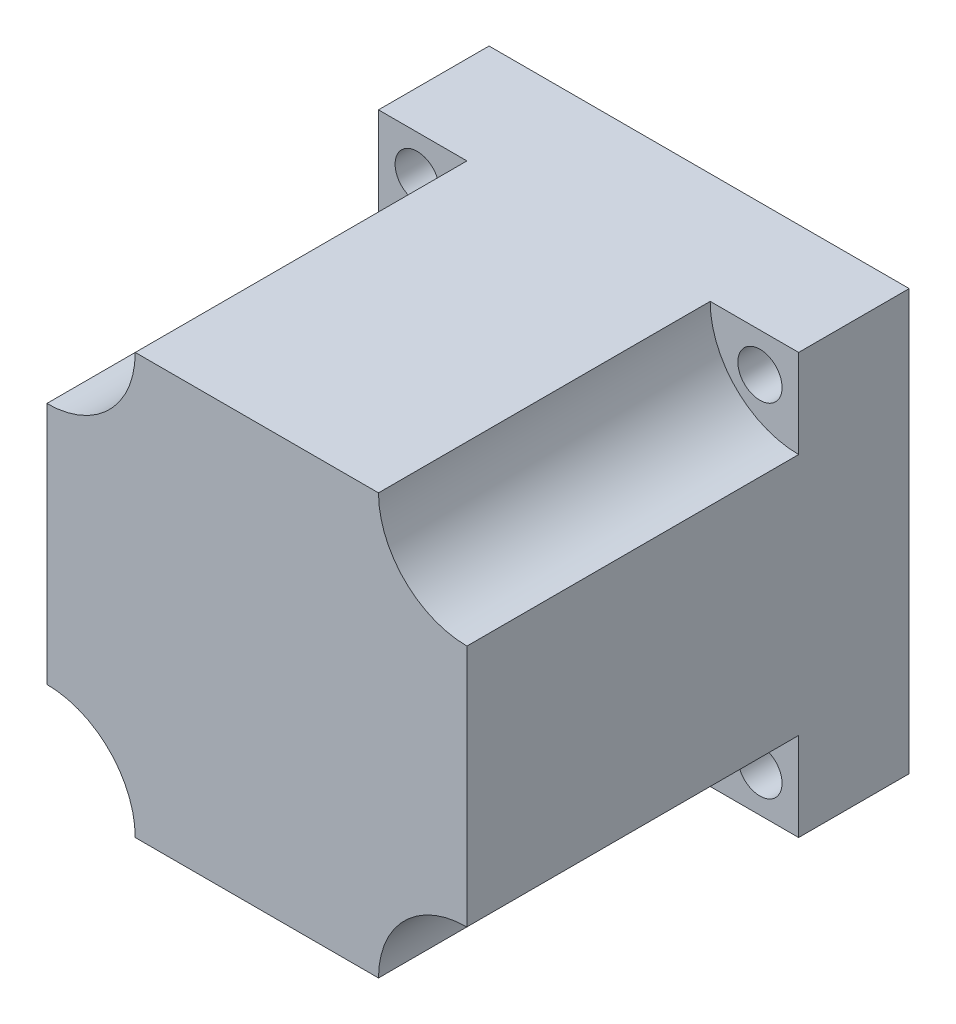
ISO-10303-21;
HEADER;
FILE_DESCRIPTION(('STEP AP214'),'2;1');
FILE_NAME('part.step','',(''),(''),'','','');
FILE_SCHEMA(('AUTOMOTIVE_DESIGN { 1 0 10303 214 1 1 1 1 }'));
ENDSEC;
DATA;
#1=APPLICATION_CONTEXT('core data for automotive mechanical design processes');
#2=APPLICATION_PROTOCOL_DEFINITION('international standard','automotive_design',2000,#1);
#3=PRODUCT_CONTEXT('',#1,'mechanical');
#4=PRODUCT('Part','Part','',(#3));
#5=PRODUCT_RELATED_PRODUCT_CATEGORY('part','',(#4));
#6=PRODUCT_DEFINITION_FORMATION('','',#4);
#7=PRODUCT_DEFINITION_CONTEXT('part definition',#1,'design');
#8=PRODUCT_DEFINITION('design','',#6,#7);
#9=PRODUCT_DEFINITION_SHAPE('','',#8);
#10=(LENGTH_UNIT() NAMED_UNIT(*) SI_UNIT(.MILLI.,.METRE.));
#11=(NAMED_UNIT(*) PLANE_ANGLE_UNIT() SI_UNIT($,.RADIAN.));
#12=(NAMED_UNIT(*) SI_UNIT($,.STERADIAN.) SOLID_ANGLE_UNIT());
#13=UNCERTAINTY_MEASURE_WITH_UNIT(LENGTH_MEASURE(1.E-05),#10,'distance_accuracy_value','');
#14=(GEOMETRIC_REPRESENTATION_CONTEXT(3) GLOBAL_UNCERTAINTY_ASSIGNED_CONTEXT((#13)) GLOBAL_UNIT_ASSIGNED_CONTEXT((#10,
#11,#12)) REPRESENTATION_CONTEXT('',''));
#15=CARTESIAN_POINT('',(0.,0.,0.));
#16=DIRECTION('',(0.,0.,1.));
#17=DIRECTION('',(1.,0.,0.));
#18=AXIS2_PLACEMENT_3D('',#15,#16,#17);
#19=CARTESIAN_POINT('',(0.,0.,10.));
#20=DIRECTION('',(0.,0.,-1.));
#21=DIRECTION('',(-1.,0.,0.));
#22=AXIS2_PLACEMENT_3D('',#19,#20,#21);
#23=PLANE('',#22);
#24=CARTESIAN_POINT('',(-15.5,15.5,10.));
#25=DIRECTION('',(0.,0.,1.));
#26=DIRECTION('',(1.,0.,0.));
#27=AXIS2_PLACEMENT_3D('',#24,#25,#26);
#28=CIRCLE('',#27,2.);
#29=CARTESIAN_POINT('',(-13.5,15.5,10.));
#30=VERTEX_POINT('',#29);
#31=EDGE_CURVE('E155',#30,#30,#28,.T.);
#32=ORIENTED_EDGE('',*,*,#31,.F.);
#33=EDGE_LOOP('',(#32));
#34=FACE_BOUND('',#33,.T.);
#35=CARTESIAN_POINT('',(-19.,19.,10.));
#36=DIRECTION('',(0.,0.,-1.));
#37=DIRECTION('',(1.,0.,0.));
#38=AXIS2_PLACEMENT_3D('',#35,#36,#37);
#39=CIRCLE('',#38,8.);
#40=CARTESIAN_POINT('',(-11.,19.,10.));
#41=VERTEX_POINT('',#40);
#42=CARTESIAN_POINT('',(-19.,11.,10.));
#43=VERTEX_POINT('',#42);
#44=EDGE_CURVE('E151',#41,#43,#39,.T.);
#45=ORIENTED_EDGE('',*,*,#44,.F.);
#46=DIRECTION('',(-1.,0.,0.));
#47=VECTOR('',#46,1.);
#48=CARTESIAN_POINT('',(-19.,19.,10.));
#49=LINE('',#48,#47);
#50=CARTESIAN_POINT('',(-19.,19.,10.));
#51=VERTEX_POINT('',#50);
#52=EDGE_CURVE('E184',#41,#51,#49,.T.);
#53=ORIENTED_EDGE('',*,*,#52,.T.);
#54=DIRECTION('',(0.,-1.,0.));
#55=VECTOR('',#54,1.);
#56=CARTESIAN_POINT('',(-19.,-19.,10.));
#57=LINE('',#56,#55);
#58=EDGE_CURVE('E189',#51,#43,#57,.T.);
#59=ORIENTED_EDGE('',*,*,#58,.T.);
#60=EDGE_LOOP('',(#45,#53,#59));
#61=FACE_BOUND('',#60,.T.);
#62=ADVANCED_FACE('F38',(#34,#61),#23,.F.);
#63=CARTESIAN_POINT('',(15.5,15.5,10.));
#64=DIRECTION('',(0.,0.,1.));
#65=DIRECTION('',(1.,0.,0.));
#66=AXIS2_PLACEMENT_3D('',#63,#64,#65);
#67=CIRCLE('',#66,2.);
#68=CARTESIAN_POINT('',(17.5,15.5,10.));
#69=VERTEX_POINT('',#68);
#70=EDGE_CURVE('E164',#69,#69,#67,.T.);
#71=ORIENTED_EDGE('',*,*,#70,.F.);
#72=EDGE_LOOP('',(#71));
#73=FACE_BOUND('',#72,.T.);
#74=CARTESIAN_POINT('',(19.,19.,10.));
#75=DIRECTION('',(0.,0.,-1.));
#76=DIRECTION('',(-1.,0.,0.));
#77=AXIS2_PLACEMENT_3D('',#74,#75,#76);
#78=CIRCLE('',#77,8.);
#79=CARTESIAN_POINT('',(19.,11.,10.));
#80=VERTEX_POINT('',#79);
#81=CARTESIAN_POINT('',(11.,19.,10.));
#82=VERTEX_POINT('',#81);
#83=EDGE_CURVE('E148',#80,#82,#78,.T.);
#84=ORIENTED_EDGE('',*,*,#83,.F.);
#85=DIRECTION('',(0.,1.,0.));
#86=VECTOR('',#85,1.);
#87=CARTESIAN_POINT('',(19.,-19.,10.));
#88=LINE('',#87,#86);
#89=CARTESIAN_POINT('',(19.,19.,10.));
#90=VERTEX_POINT('',#89);
#91=EDGE_CURVE('E185',#80,#90,#88,.T.);
#92=ORIENTED_EDGE('',*,*,#91,.T.);
#93=EDGE_CURVE('E186',#90,#82,#49,.T.);
#94=ORIENTED_EDGE('',*,*,#93,.T.);
#95=EDGE_LOOP('',(#84,#92,#94));
#96=FACE_BOUND('',#95,.T.);
#97=ADVANCED_FACE('F295',(#73,#96),#23,.F.);
#98=CARTESIAN_POINT('',(15.5,-15.5,10.));
#99=DIRECTION('',(0.,0.,1.));
#100=DIRECTION('',(1.,0.,0.));
#101=AXIS2_PLACEMENT_3D('',#98,#99,#100);
#102=CIRCLE('',#101,2.);
#103=CARTESIAN_POINT('',(17.5,-15.5,10.));
#104=VERTEX_POINT('',#103);
#105=EDGE_CURVE('E161',#104,#104,#102,.T.);
#106=ORIENTED_EDGE('',*,*,#105,.F.);
#107=EDGE_LOOP('',(#106));
#108=FACE_BOUND('',#107,.T.);
#109=CARTESIAN_POINT('',(19.,-19.,10.));
#110=DIRECTION('',(0.,0.,-1.));
#111=DIRECTION('',(1.,0.,0.));
#112=AXIS2_PLACEMENT_3D('',#109,#110,#111);
#113=CIRCLE('',#112,8.);
#114=CARTESIAN_POINT('',(11.,-19.,10.));
#115=VERTEX_POINT('',#114);
#116=CARTESIAN_POINT('',(19.,-11.,10.));
#117=VERTEX_POINT('',#116);
#118=EDGE_CURVE('E53',#115,#117,#113,.T.);
#119=ORIENTED_EDGE('',*,*,#118,.F.);
#120=DIRECTION('',(1.,0.,0.));
#121=VECTOR('',#120,1.);
#122=CARTESIAN_POINT('',(-19.,-19.,10.));
#123=LINE('',#122,#121);
#124=CARTESIAN_POINT('',(19.,-19.,10.));
#125=VERTEX_POINT('',#124);
#126=EDGE_CURVE('E191',#115,#125,#123,.T.);
#127=ORIENTED_EDGE('',*,*,#126,.T.);
#128=EDGE_CURVE('E182',#125,#117,#88,.T.);
#129=ORIENTED_EDGE('',*,*,#128,.T.);
#130=EDGE_LOOP('',(#119,#127,#129));
#131=FACE_BOUND('',#130,.T.);
#132=ADVANCED_FACE('F228',(#108,#131),#23,.F.);
#133=CARTESIAN_POINT('',(-15.5,-15.5,10.));
#134=DIRECTION('',(0.,0.,1.));
#135=DIRECTION('',(1.,0.,0.));
#136=AXIS2_PLACEMENT_3D('',#133,#134,#135);
#137=CIRCLE('',#136,2.);
#138=CARTESIAN_POINT('',(-13.5,-15.5,10.));
#139=VERTEX_POINT('',#138);
#140=EDGE_CURVE('E168',#139,#139,#137,.T.);
#141=ORIENTED_EDGE('',*,*,#140,.F.);
#142=EDGE_LOOP('',(#141));
#143=FACE_BOUND('',#142,.T.);
#144=CARTESIAN_POINT('',(-19.,-19.,10.));
#145=DIRECTION('',(0.,0.,-1.));
#146=DIRECTION('',(-1.,0.,0.));
#147=AXIS2_PLACEMENT_3D('',#144,#145,#146);
#148=CIRCLE('',#147,8.);
#149=CARTESIAN_POINT('',(-19.,-11.,10.));
#150=VERTEX_POINT('',#149);
#151=CARTESIAN_POINT('',(-11.,-19.,10.));
#152=VERTEX_POINT('',#151);
#153=EDGE_CURVE('E61',#150,#152,#148,.T.);
#154=ORIENTED_EDGE('',*,*,#153,.F.);
#155=CARTESIAN_POINT('',(-19.,-19.,10.));
#156=VERTEX_POINT('',#155);
#157=EDGE_CURVE('E188',#150,#156,#57,.T.);
#158=ORIENTED_EDGE('',*,*,#157,.T.);
#159=EDGE_CURVE('E192',#156,#152,#123,.T.);
#160=ORIENTED_EDGE('',*,*,#159,.T.);
#161=EDGE_LOOP('',(#154,#158,#160));
#162=FACE_BOUND('',#161,.T.);
#163=ADVANCED_FACE('F310',(#143,#162),#23,.F.);
#164=CARTESIAN_POINT('',(19.,-19.,10.));
#165=DIRECTION('',(-1.,0.,0.));
#166=DIRECTION('',(0.,0.,1.));
#167=AXIS2_PLACEMENT_3D('',#164,#165,#166);
#168=PLANE('',#167);
#169=DIRECTION('',(0.,1.,0.));
#170=VECTOR('',#169,1.);
#171=CARTESIAN_POINT('',(19.,-19.,0.));
#172=LINE('',#171,#170);
#173=CARTESIAN_POINT('',(19.,-19.,0.));
#174=VERTEX_POINT('',#173);
#175=CARTESIAN_POINT('',(19.,19.,0.));
#176=VERTEX_POINT('',#175);
#177=EDGE_CURVE('E179',#174,#176,#172,.T.);
#178=ORIENTED_EDGE('',*,*,#177,.T.);
#179=DIRECTION('',(0.,0.,-1.));
#180=VECTOR('',#179,1.);
#181=CARTESIAN_POINT('',(19.,19.,10.));
#182=LINE('',#181,#180);
#183=EDGE_CURVE('E11',#90,#176,#182,.T.);
#184=ORIENTED_EDGE('',*,*,#183,.F.);
#185=ORIENTED_EDGE('',*,*,#91,.F.);
#186=DIRECTION('',(0.,0.,-1.));
#187=VECTOR('',#186,1.);
#188=CARTESIAN_POINT('',(19.,11.,40.));
#189=LINE('',#188,#187);
#190=CARTESIAN_POINT('',(19.,11.,40.));
#191=VERTEX_POINT('',#190);
#192=EDGE_CURVE('E246',#191,#80,#189,.T.);
#193=ORIENTED_EDGE('',*,*,#192,.F.);
#194=DIRECTION('',(0.,1.,0.));
#195=VECTOR('',#194,1.);
#196=CARTESIAN_POINT('',(19.,-11.,40.));
#197=LINE('',#196,#195);
#198=CARTESIAN_POINT('',(19.,-11.,40.));
#199=VERTEX_POINT('',#198);
#200=EDGE_CURVE('E261',#199,#191,#197,.T.);
#201=ORIENTED_EDGE('',*,*,#200,.F.);
#202=DIRECTION('',(0.,0.,-1.));
#203=VECTOR('',#202,1.);
#204=CARTESIAN_POINT('',(19.,-11.,40.));
#205=LINE('',#204,#203);
#206=EDGE_CURVE('E227',#199,#117,#205,.T.);
#207=ORIENTED_EDGE('',*,*,#206,.T.);
#208=ORIENTED_EDGE('',*,*,#128,.F.);
#209=DIRECTION('',(0.,0.,-1.));
#210=VECTOR('',#209,1.);
#211=CARTESIAN_POINT('',(19.,-19.,10.));
#212=LINE('',#211,#210);
#213=EDGE_CURVE('E194',#125,#174,#212,.T.);
#214=ORIENTED_EDGE('',*,*,#213,.T.);
#215=EDGE_LOOP('',(#178,#184,#185,#193,#201,#207,#208,#214));
#216=FACE_BOUND('',#215,.T.);
#217=ADVANCED_FACE('F40',(#216),#168,.F.);
#218=CARTESIAN_POINT('',(-19.,19.,10.));
#219=DIRECTION('',(0.,-1.,0.));
#220=DIRECTION('',(0.,0.,-1.));
#221=AXIS2_PLACEMENT_3D('',#218,#219,#220);
#222=PLANE('',#221);
#223=DIRECTION('',(-1.,0.,0.));
#224=VECTOR('',#223,1.);
#225=CARTESIAN_POINT('',(-19.,19.,0.));
#226=LINE('',#225,#224);
#227=CARTESIAN_POINT('',(-19.,19.,0.));
#228=VERTEX_POINT('',#227);
#229=EDGE_CURVE('E197',#176,#228,#226,.T.);
#230=ORIENTED_EDGE('',*,*,#229,.T.);
#231=DIRECTION('',(0.,0.,-1.));
#232=VECTOR('',#231,1.);
#233=CARTESIAN_POINT('',(-19.,19.,10.));
#234=LINE('',#233,#232);
#235=EDGE_CURVE('E46',#51,#228,#234,.T.);
#236=ORIENTED_EDGE('',*,*,#235,.F.);
#237=ORIENTED_EDGE('',*,*,#52,.F.);
#238=DIRECTION('',(0.,0.,-1.));
#239=VECTOR('',#238,1.);
#240=CARTESIAN_POINT('',(-11.,19.,40.));
#241=LINE('',#240,#239);
#242=CARTESIAN_POINT('',(-11.,19.,40.));
#243=VERTEX_POINT('',#242);
#244=EDGE_CURVE('E241',#243,#41,#241,.T.);
#245=ORIENTED_EDGE('',*,*,#244,.F.);
#246=DIRECTION('',(-1.,0.,0.));
#247=VECTOR('',#246,1.);
#248=CARTESIAN_POINT('',(11.,19.,40.));
#249=LINE('',#248,#247);
#250=CARTESIAN_POINT('',(11.,19.,40.));
#251=VERTEX_POINT('',#250);
#252=EDGE_CURVE('E144',#251,#243,#249,.T.);
#253=ORIENTED_EDGE('',*,*,#252,.F.);
#254=DIRECTION('',(0.,0.,-1.));
#255=VECTOR('',#254,1.);
#256=CARTESIAN_POINT('',(11.,19.,40.));
#257=LINE('',#256,#255);
#258=EDGE_CURVE('E243',#251,#82,#257,.T.);
#259=ORIENTED_EDGE('',*,*,#258,.T.);
#260=ORIENTED_EDGE('',*,*,#93,.F.);
#261=ORIENTED_EDGE('',*,*,#183,.T.);
#262=EDGE_LOOP('',(#230,#236,#237,#245,#253,#259,#260,#261));
#263=FACE_BOUND('',#262,.T.);
#264=ADVANCED_FACE('F306',(#263),#222,.F.);
#265=CARTESIAN_POINT('',(-19.,-19.,10.));
#266=DIRECTION('',(1.,0.,0.));
#267=DIRECTION('',(0.,0.,-1.));
#268=AXIS2_PLACEMENT_3D('',#265,#266,#267);
#269=PLANE('',#268);
#270=DIRECTION('',(0.,-1.,0.));
#271=VECTOR('',#270,1.);
#272=CARTESIAN_POINT('',(-19.,-19.,0.));
#273=LINE('',#272,#271);
#274=CARTESIAN_POINT('',(-19.,-19.,0.));
#275=VERTEX_POINT('',#274);
#276=EDGE_CURVE('E199',#228,#275,#273,.T.);
#277=ORIENTED_EDGE('',*,*,#276,.T.);
#278=DIRECTION('',(0.,0.,-1.));
#279=VECTOR('',#278,1.);
#280=CARTESIAN_POINT('',(-19.,-19.,10.));
#281=LINE('',#280,#279);
#282=EDGE_CURVE('E205',#156,#275,#281,.T.);
#283=ORIENTED_EDGE('',*,*,#282,.F.);
#284=ORIENTED_EDGE('',*,*,#157,.F.);
#285=DIRECTION('',(0.,0.,-1.));
#286=VECTOR('',#285,1.);
#287=CARTESIAN_POINT('',(-19.,-11.,40.));
#288=LINE('',#287,#286);
#289=CARTESIAN_POINT('',(-19.,-11.,40.));
#290=VERTEX_POINT('',#289);
#291=EDGE_CURVE('E135',#290,#150,#288,.T.);
#292=ORIENTED_EDGE('',*,*,#291,.F.);
#293=DIRECTION('',(0.,-1.,0.));
#294=VECTOR('',#293,1.);
#295=CARTESIAN_POINT('',(-19.,11.,40.));
#296=LINE('',#295,#294);
#297=CARTESIAN_POINT('',(-19.,11.,40.));
#298=VERTEX_POINT('',#297);
#299=EDGE_CURVE('E127',#298,#290,#296,.T.);
#300=ORIENTED_EDGE('',*,*,#299,.F.);
#301=DIRECTION('',(0.,0.,-1.));
#302=VECTOR('',#301,1.);
#303=CARTESIAN_POINT('',(-19.,11.,40.));
#304=LINE('',#303,#302);
#305=EDGE_CURVE('E132',#298,#43,#304,.T.);
#306=ORIENTED_EDGE('',*,*,#305,.T.);
#307=ORIENTED_EDGE('',*,*,#58,.F.);
#308=ORIENTED_EDGE('',*,*,#235,.T.);
#309=EDGE_LOOP('',(#277,#283,#284,#292,#300,#306,#307,#308));
#310=FACE_BOUND('',#309,.T.);
#311=ADVANCED_FACE('F129',(#310),#269,.F.);
#312=CARTESIAN_POINT('',(-19.,-19.,10.));
#313=DIRECTION('',(0.,1.,0.));
#314=DIRECTION('',(0.,0.,1.));
#315=AXIS2_PLACEMENT_3D('',#312,#313,#314);
#316=PLANE('',#315);
#317=DIRECTION('',(1.,0.,0.));
#318=VECTOR('',#317,1.);
#319=CARTESIAN_POINT('',(-19.,-19.,0.));
#320=LINE('',#319,#318);
#321=EDGE_CURVE('E201',#275,#174,#320,.T.);
#322=ORIENTED_EDGE('',*,*,#321,.T.);
#323=ORIENTED_EDGE('',*,*,#213,.F.);
#324=ORIENTED_EDGE('',*,*,#126,.F.);
#325=DIRECTION('',(0.,0.,-1.));
#326=VECTOR('',#325,1.);
#327=CARTESIAN_POINT('',(11.,-19.,40.));
#328=LINE('',#327,#326);
#329=CARTESIAN_POINT('',(11.,-19.,40.));
#330=VERTEX_POINT('',#329);
#331=EDGE_CURVE('E234',#330,#115,#328,.T.);
#332=ORIENTED_EDGE('',*,*,#331,.F.);
#333=DIRECTION('',(1.,0.,0.));
#334=VECTOR('',#333,1.);
#335=CARTESIAN_POINT('',(-11.,-19.,40.));
#336=LINE('',#335,#334);
#337=CARTESIAN_POINT('',(-11.,-19.,40.));
#338=VERTEX_POINT('',#337);
#339=EDGE_CURVE('E253',#338,#330,#336,.T.);
#340=ORIENTED_EDGE('',*,*,#339,.F.);
#341=DIRECTION('',(0.,0.,-1.));
#342=VECTOR('',#341,1.);
#343=CARTESIAN_POINT('',(-11.,-19.,40.));
#344=LINE('',#343,#342);
#345=EDGE_CURVE('E157',#338,#152,#344,.T.);
#346=ORIENTED_EDGE('',*,*,#345,.T.);
#347=ORIENTED_EDGE('',*,*,#159,.F.);
#348=ORIENTED_EDGE('',*,*,#282,.T.);
#349=EDGE_LOOP('',(#322,#323,#324,#332,#340,#346,#347,#348));
#350=FACE_BOUND('',#349,.T.);
#351=ADVANCED_FACE('F219',(#350),#316,.F.);
#352=CARTESIAN_POINT('',(0.,0.,0.));
#353=DIRECTION('',(0.,0.,-1.));
#354=DIRECTION('',(-1.,0.,0.));
#355=AXIS2_PLACEMENT_3D('',#352,#353,#354);
#356=PLANE('',#355);
#357=CARTESIAN_POINT('',(0.,0.,0.));
#358=DIRECTION('',(0.,0.,-1.));
#359=DIRECTION('',(-1.,0.,0.));
#360=AXIS2_PLACEMENT_3D('',#357,#358,#359);
#361=CIRCLE('',#360,2.5);
#362=CARTESIAN_POINT('',(-2.5,0.,0.));
#363=VERTEX_POINT('',#362);
#364=EDGE_CURVE('E267',#363,#363,#361,.T.);
#365=ORIENTED_EDGE('',*,*,#364,.F.);
#366=EDGE_LOOP('',(#365));
#367=FACE_BOUND('',#366,.T.);
#368=CARTESIAN_POINT('',(-15.5,15.5,0.));
#369=DIRECTION('',(0.,0.,1.));
#370=DIRECTION('',(1.,0.,0.));
#371=AXIS2_PLACEMENT_3D('',#368,#369,#370);
#372=CIRCLE('',#371,2.);
#373=CARTESIAN_POINT('',(-13.5,15.5,0.));
#374=VERTEX_POINT('',#373);
#375=EDGE_CURVE('E152',#374,#374,#372,.T.);
#376=ORIENTED_EDGE('',*,*,#375,.T.);
#377=EDGE_LOOP('',(#376));
#378=FACE_BOUND('',#377,.T.);
#379=CARTESIAN_POINT('',(-15.5,-15.5,0.));
#380=DIRECTION('',(0.,0.,1.));
#381=DIRECTION('',(1.,0.,0.));
#382=AXIS2_PLACEMENT_3D('',#379,#380,#381);
#383=CIRCLE('',#382,2.);
#384=CARTESIAN_POINT('',(-13.5,-15.5,0.));
#385=VERTEX_POINT('',#384);
#386=EDGE_CURVE('E171',#385,#385,#383,.T.);
#387=ORIENTED_EDGE('',*,*,#386,.T.);
#388=EDGE_LOOP('',(#387));
#389=FACE_BOUND('',#388,.T.);
#390=CARTESIAN_POINT('',(15.5,-15.5,0.));
#391=DIRECTION('',(0.,0.,1.));
#392=DIRECTION('',(1.,0.,0.));
#393=AXIS2_PLACEMENT_3D('',#390,#391,#392);
#394=CIRCLE('',#393,2.);
#395=CARTESIAN_POINT('',(17.5,-15.5,0.));
#396=VERTEX_POINT('',#395);
#397=EDGE_CURVE('E165',#396,#396,#394,.T.);
#398=ORIENTED_EDGE('',*,*,#397,.T.);
#399=EDGE_LOOP('',(#398));
#400=FACE_BOUND('',#399,.T.);
#401=CARTESIAN_POINT('',(15.5,15.5,0.));
#402=DIRECTION('',(0.,0.,1.));
#403=DIRECTION('',(1.,0.,0.));
#404=AXIS2_PLACEMENT_3D('',#401,#402,#403);
#405=CIRCLE('',#404,2.);
#406=CARTESIAN_POINT('',(17.5,15.5,0.));
#407=VERTEX_POINT('',#406);
#408=EDGE_CURVE('E176',#407,#407,#405,.T.);
#409=ORIENTED_EDGE('',*,*,#408,.T.);
#410=EDGE_LOOP('',(#409));
#411=FACE_BOUND('',#410,.T.);
#412=ORIENTED_EDGE('',*,*,#177,.F.);
#413=ORIENTED_EDGE('',*,*,#321,.F.);
#414=ORIENTED_EDGE('',*,*,#276,.F.);
#415=ORIENTED_EDGE('',*,*,#229,.F.);
#416=EDGE_LOOP('',(#412,#413,#414,#415));
#417=FACE_BOUND('',#416,.T.);
#418=ADVANCED_FACE('F216',(#367,#378,#389,#400,#411,#417),#356,.T.);
#419=CARTESIAN_POINT('',(15.5,15.5,0.));
#420=DIRECTION('',(0.,0.,1.));
#421=DIRECTION('',(1.,0.,0.));
#422=AXIS2_PLACEMENT_3D('',#419,#420,#421);
#423=CYLINDRICAL_SURFACE('',#422,2.);
#424=ORIENTED_EDGE('',*,*,#408,.F.);
#425=EDGE_LOOP('',(#424));
#426=FACE_BOUND('',#425,.T.);
#427=ORIENTED_EDGE('',*,*,#70,.T.);
#428=EDGE_LOOP('',(#427));
#429=FACE_BOUND('',#428,.T.);
#430=ADVANCED_FACE('F279',(#426,#429),#423,.F.);
#431=CARTESIAN_POINT('',(15.5,-15.5,0.));
#432=DIRECTION('',(0.,0.,1.));
#433=DIRECTION('',(1.,0.,0.));
#434=AXIS2_PLACEMENT_3D('',#431,#432,#433);
#435=CYLINDRICAL_SURFACE('',#434,2.);
#436=ORIENTED_EDGE('',*,*,#397,.F.);
#437=EDGE_LOOP('',(#436));
#438=FACE_BOUND('',#437,.T.);
#439=ORIENTED_EDGE('',*,*,#105,.T.);
#440=EDGE_LOOP('',(#439));
#441=FACE_BOUND('',#440,.T.);
#442=ADVANCED_FACE('F291',(#438,#441),#435,.F.);
#443=CARTESIAN_POINT('',(-15.5,-15.5,0.));
#444=DIRECTION('',(0.,0.,1.));
#445=DIRECTION('',(1.,0.,0.));
#446=AXIS2_PLACEMENT_3D('',#443,#444,#445);
#447=CYLINDRICAL_SURFACE('',#446,2.);
#448=ORIENTED_EDGE('',*,*,#386,.F.);
#449=EDGE_LOOP('',(#448));
#450=FACE_BOUND('',#449,.T.);
#451=ORIENTED_EDGE('',*,*,#140,.T.);
#452=EDGE_LOOP('',(#451));
#453=FACE_BOUND('',#452,.T.);
#454=ADVANCED_FACE('F323',(#450,#453),#447,.F.);
#455=CARTESIAN_POINT('',(-15.5,15.5,0.));
#456=DIRECTION('',(0.,0.,1.));
#457=DIRECTION('',(1.,0.,0.));
#458=AXIS2_PLACEMENT_3D('',#455,#456,#457);
#459=CYLINDRICAL_SURFACE('',#458,2.);
#460=ORIENTED_EDGE('',*,*,#375,.F.);
#461=EDGE_LOOP('',(#460));
#462=FACE_BOUND('',#461,.T.);
#463=ORIENTED_EDGE('',*,*,#31,.T.);
#464=EDGE_LOOP('',(#463));
#465=FACE_BOUND('',#464,.T.);
#466=ADVANCED_FACE('F325',(#462,#465),#459,.F.);
#467=CARTESIAN_POINT('',(-19.,19.,40.));
#468=DIRECTION('',(0.,0.,-1.));
#469=DIRECTION('',(-1.,0.,0.));
#470=AXIS2_PLACEMENT_3D('',#467,#468,#469);
#471=CYLINDRICAL_SURFACE('',#470,8.);
#472=ORIENTED_EDGE('',*,*,#44,.T.);
#473=ORIENTED_EDGE('',*,*,#305,.F.);
#474=CARTESIAN_POINT('',(-19.,19.,40.));
#475=DIRECTION('',(0.,0.,-1.));
#476=DIRECTION('',(1.,0.,0.));
#477=AXIS2_PLACEMENT_3D('',#474,#475,#476);
#478=CIRCLE('',#477,8.);
#479=EDGE_CURVE('E139',#243,#298,#478,.T.);
#480=ORIENTED_EDGE('',*,*,#479,.F.);
#481=ORIENTED_EDGE('',*,*,#244,.T.);
#482=EDGE_LOOP('',(#472,#473,#480,#481));
#483=FACE_BOUND('',#482,.T.);
#484=ADVANCED_FACE('F150',(#483),#471,.F.);
#485=CARTESIAN_POINT('',(-19.,-19.,40.));
#486=DIRECTION('',(0.,0.,-1.));
#487=DIRECTION('',(-1.,0.,0.));
#488=AXIS2_PLACEMENT_3D('',#485,#486,#487);
#489=CYLINDRICAL_SURFACE('',#488,8.);
#490=ORIENTED_EDGE('',*,*,#153,.T.);
#491=ORIENTED_EDGE('',*,*,#345,.F.);
#492=CARTESIAN_POINT('',(-19.,-19.,40.));
#493=DIRECTION('',(0.,0.,-1.));
#494=DIRECTION('',(-1.,0.,0.));
#495=AXIS2_PLACEMENT_3D('',#492,#493,#494);
#496=CIRCLE('',#495,8.);
#497=EDGE_CURVE('E138',#290,#338,#496,.T.);
#498=ORIENTED_EDGE('',*,*,#497,.F.);
#499=ORIENTED_EDGE('',*,*,#291,.T.);
#500=EDGE_LOOP('',(#490,#491,#498,#499));
#501=FACE_BOUND('',#500,.T.);
#502=ADVANCED_FACE('F255',(#501),#489,.F.);
#503=CARTESIAN_POINT('',(19.,-19.,40.));
#504=DIRECTION('',(0.,0.,-1.));
#505=DIRECTION('',(-1.,0.,0.));
#506=AXIS2_PLACEMENT_3D('',#503,#504,#505);
#507=CYLINDRICAL_SURFACE('',#506,8.);
#508=ORIENTED_EDGE('',*,*,#118,.T.);
#509=ORIENTED_EDGE('',*,*,#206,.F.);
#510=CARTESIAN_POINT('',(19.,-19.,40.));
#511=DIRECTION('',(0.,0.,-1.));
#512=DIRECTION('',(1.,0.,0.));
#513=AXIS2_PLACEMENT_3D('',#510,#511,#512);
#514=CIRCLE('',#513,8.);
#515=EDGE_CURVE('E257',#330,#199,#514,.T.);
#516=ORIENTED_EDGE('',*,*,#515,.F.);
#517=ORIENTED_EDGE('',*,*,#331,.T.);
#518=EDGE_LOOP('',(#508,#509,#516,#517));
#519=FACE_BOUND('',#518,.T.);
#520=ADVANCED_FACE('F231',(#519),#507,.F.);
#521=CARTESIAN_POINT('',(19.,19.,40.));
#522=DIRECTION('',(0.,0.,-1.));
#523=DIRECTION('',(-1.,0.,0.));
#524=AXIS2_PLACEMENT_3D('',#521,#522,#523);
#525=CYLINDRICAL_SURFACE('',#524,8.);
#526=ORIENTED_EDGE('',*,*,#83,.T.);
#527=ORIENTED_EDGE('',*,*,#258,.F.);
#528=CARTESIAN_POINT('',(19.,19.,40.));
#529=DIRECTION('',(0.,0.,-1.));
#530=DIRECTION('',(-1.,0.,0.));
#531=AXIS2_PLACEMENT_3D('',#528,#529,#530);
#532=CIRCLE('',#531,8.);
#533=EDGE_CURVE('E263',#191,#251,#532,.T.);
#534=ORIENTED_EDGE('',*,*,#533,.F.);
#535=ORIENTED_EDGE('',*,*,#192,.T.);
#536=EDGE_LOOP('',(#526,#527,#534,#535));
#537=FACE_BOUND('',#536,.T.);
#538=ADVANCED_FACE('F305',(#537),#525,.F.);
#539=CARTESIAN_POINT('',(-19.,19.,40.));
#540=DIRECTION('',(0.,0.,1.));
#541=DIRECTION('',(1.,0.,0.));
#542=AXIS2_PLACEMENT_3D('',#539,#540,#541);
#543=PLANE('',#542);
#544=ORIENTED_EDGE('',*,*,#479,.T.);
#545=ORIENTED_EDGE('',*,*,#299,.T.);
#546=ORIENTED_EDGE('',*,*,#497,.T.);
#547=ORIENTED_EDGE('',*,*,#339,.T.);
#548=ORIENTED_EDGE('',*,*,#515,.T.);
#549=ORIENTED_EDGE('',*,*,#200,.T.);
#550=ORIENTED_EDGE('',*,*,#533,.T.);
#551=ORIENTED_EDGE('',*,*,#252,.T.);
#552=EDGE_LOOP('',(#544,#545,#546,#547,#548,#549,#550,#551));
#553=FACE_BOUND('',#552,.T.);
#554=ADVANCED_FACE('F142',(#553),#543,.T.);
#555=CARTESIAN_POINT('',(0.,0.,-10.));
#556=DIRECTION('',(0.,0.,1.));
#557=DIRECTION('',(1.,0.,0.));
#558=AXIS2_PLACEMENT_3D('',#555,#556,#557);
#559=CYLINDRICAL_SURFACE('',#558,2.5);
#560=CARTESIAN_POINT('',(0.,0.,-10.));
#561=DIRECTION('',(0.,0.,-1.));
#562=DIRECTION('',(-1.,0.,0.));
#563=AXIS2_PLACEMENT_3D('',#560,#561,#562);
#564=CIRCLE('',#563,2.5);
#565=CARTESIAN_POINT('',(-2.5,0.,-10.));
#566=VERTEX_POINT('',#565);
#567=EDGE_CURVE('E265',#566,#566,#564,.T.);
#568=ORIENTED_EDGE('',*,*,#567,.F.);
#569=EDGE_LOOP('',(#568));
#570=FACE_BOUND('',#569,.T.);
#571=ORIENTED_EDGE('',*,*,#364,.T.);
#572=EDGE_LOOP('',(#571));
#573=FACE_BOUND('',#572,.T.);
#574=ADVANCED_FACE('F275',(#570,#573),#559,.T.);
#575=CARTESIAN_POINT('',(0.,0.,-10.));
#576=DIRECTION('',(0.,0.,-1.));
#577=DIRECTION('',(-1.,0.,0.));
#578=AXIS2_PLACEMENT_3D('',#575,#576,#577);
#579=PLANE('',#578);
#580=ORIENTED_EDGE('',*,*,#567,.T.);
#581=EDGE_LOOP('',(#580));
#582=FACE_BOUND('',#581,.T.);
#583=ADVANCED_FACE('F349',(#582),#579,.T.);
#584=CLOSED_SHELL('',(#62,#97,#132,#163,#217,#264,#311,#351,#418,#430,#442,#454,#466,#484,#502,
#520,#538,#554,#574,#583));
#585=MANIFOLD_SOLID_BREP('B2',#584);
#586=ADVANCED_BREP_SHAPE_REPRESENTATION('',(#18,#585),#14);
#587=SHAPE_DEFINITION_REPRESENTATION(#9,#586);
ENDSEC;
END-ISO-10303-21;
